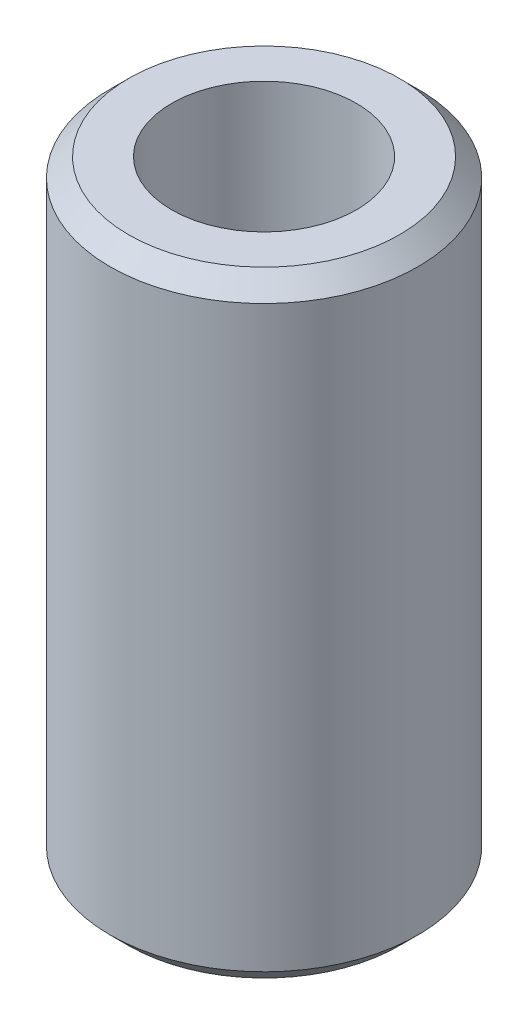
ISO-10303-21;
HEADER;
FILE_DESCRIPTION(('STEP AP214'),'2;1');
FILE_NAME('part.step','',(''),(''),'','','');
FILE_SCHEMA(('AUTOMOTIVE_DESIGN { 1 0 10303 214 1 1 1 1 }'));
ENDSEC;
DATA;
#1=APPLICATION_CONTEXT('core data for automotive mechanical design processes');
#2=APPLICATION_PROTOCOL_DEFINITION('international standard','automotive_design',2000,#1);
#3=PRODUCT_CONTEXT('',#1,'mechanical');
#4=PRODUCT('Part','Part','',(#3));
#5=PRODUCT_RELATED_PRODUCT_CATEGORY('part','',(#4));
#6=PRODUCT_DEFINITION_FORMATION('','',#4);
#7=PRODUCT_DEFINITION_CONTEXT('part definition',#1,'design');
#8=PRODUCT_DEFINITION('design','',#6,#7);
#9=PRODUCT_DEFINITION_SHAPE('','',#8);
#10=(LENGTH_UNIT() NAMED_UNIT(*) SI_UNIT(.MILLI.,.METRE.));
#11=(NAMED_UNIT(*) PLANE_ANGLE_UNIT() SI_UNIT($,.RADIAN.));
#12=(NAMED_UNIT(*) SI_UNIT($,.STERADIAN.) SOLID_ANGLE_UNIT());
#13=UNCERTAINTY_MEASURE_WITH_UNIT(LENGTH_MEASURE(1.E-05),#10,'distance_accuracy_value','');
#14=(GEOMETRIC_REPRESENTATION_CONTEXT(3) GLOBAL_UNCERTAINTY_ASSIGNED_CONTEXT((#13)) GLOBAL_UNIT_ASSIGNED_CONTEXT((#10,
#11,#12)) REPRESENTATION_CONTEXT('',''));
#15=CARTESIAN_POINT('',(0.,0.,0.));
#16=DIRECTION('',(0.,0.,1.));
#17=DIRECTION('',(1.,0.,0.));
#18=AXIS2_PLACEMENT_3D('',#15,#16,#17);
#19=CARTESIAN_POINT('',(0.,10.,0.));
#20=DIRECTION('',(0.,1.,0.));
#21=DIRECTION('',(0.,0.,1.));
#22=AXIS2_PLACEMENT_3D('',#19,#20,#21);
#23=PLANE('',#22);
#24=CARTESIAN_POINT('',(0.,10.,0.));
#25=DIRECTION('',(0.,1.,0.));
#26=DIRECTION('',(0.,0.,1.));
#27=AXIS2_PLACEMENT_3D('',#24,#25,#26);
#28=CIRCLE('',#27,2.2);
#29=CARTESIAN_POINT('',(0.,10.,2.2));
#30=VERTEX_POINT('',#29);
#31=EDGE_CURVE('E10',#30,#30,#28,.T.);
#32=ORIENTED_EDGE('',*,*,#31,.T.);
#33=EDGE_LOOP('',(#32));
#34=FACE_BOUND('',#33,.T.);
#35=CARTESIAN_POINT('',(0.,10.,0.));
#36=DIRECTION('',(0.,1.,0.));
#37=DIRECTION('',(0.,0.,1.));
#38=AXIS2_PLACEMENT_3D('',#35,#36,#37);
#39=CIRCLE('',#38,1.5);
#40=CARTESIAN_POINT('',(0.,10.,1.5));
#41=VERTEX_POINT('',#40);
#42=EDGE_CURVE('E60',#41,#41,#39,.T.);
#43=ORIENTED_EDGE('',*,*,#42,.F.);
#44=EDGE_LOOP('',(#43));
#45=FACE_BOUND('',#44,.T.);
#46=ADVANCED_FACE('F39',(#34,#45),#23,.T.);
#47=CARTESIAN_POINT('',(0.,0.,0.));
#48=DIRECTION('',(0.,1.,0.));
#49=DIRECTION('',(0.,0.,1.));
#50=AXIS2_PLACEMENT_3D('',#47,#48,#49);
#51=PLANE('',#50);
#52=CARTESIAN_POINT('',(0.,0.,0.));
#53=DIRECTION('',(0.,1.,0.));
#54=DIRECTION('',(0.,0.,1.));
#55=AXIS2_PLACEMENT_3D('',#52,#53,#54);
#56=CIRCLE('',#55,2.2);
#57=CARTESIAN_POINT('',(0.,0.,2.2));
#58=VERTEX_POINT('',#57);
#59=EDGE_CURVE('E47',#58,#58,#56,.F.);
#60=ORIENTED_EDGE('',*,*,#59,.T.);
#61=EDGE_LOOP('',(#60));
#62=FACE_BOUND('',#61,.T.);
#63=CARTESIAN_POINT('',(0.,0.,0.));
#64=DIRECTION('',(0.,1.,0.));
#65=DIRECTION('',(0.,0.,1.));
#66=AXIS2_PLACEMENT_3D('',#63,#64,#65);
#67=CIRCLE('',#66,1.5);
#68=CARTESIAN_POINT('',(0.,0.,1.5));
#69=VERTEX_POINT('',#68);
#70=EDGE_CURVE('E61',#69,#69,#67,.T.);
#71=ORIENTED_EDGE('',*,*,#70,.T.);
#72=EDGE_LOOP('',(#71));
#73=FACE_BOUND('',#72,.T.);
#74=ADVANCED_FACE('F71',(#62,#73),#51,.F.);
#75=CARTESIAN_POINT('',(0.,10.,0.));
#76=DIRECTION('',(0.,-1.,0.));
#77=DIRECTION('',(0.,0.,-1.));
#78=AXIS2_PLACEMENT_3D('',#75,#76,#77);
#79=CYLINDRICAL_SURFACE('',#78,2.5);
#80=CARTESIAN_POINT('',(0.,0.300000000000003,0.));
#81=DIRECTION('',(0.,1.,0.));
#82=DIRECTION('',(0.,0.,1.));
#83=AXIS2_PLACEMENT_3D('',#80,#81,#82);
#84=CIRCLE('',#83,2.5);
#85=CARTESIAN_POINT('',(0.,0.300000000000003,2.5));
#86=VERTEX_POINT('',#85);
#87=EDGE_CURVE('E51',#86,#86,#84,.T.);
#88=ORIENTED_EDGE('',*,*,#87,.T.);
#89=EDGE_LOOP('',(#88));
#90=FACE_BOUND('',#89,.T.);
#91=CARTESIAN_POINT('',(0.,9.7,0.));
#92=DIRECTION('',(0.,1.,0.));
#93=DIRECTION('',(0.,0.,1.));
#94=AXIS2_PLACEMENT_3D('',#91,#92,#93);
#95=CIRCLE('',#94,2.5);
#96=CARTESIAN_POINT('',(0.,9.7,2.5));
#97=VERTEX_POINT('',#96);
#98=EDGE_CURVE('E55',#97,#97,#95,.F.);
#99=ORIENTED_EDGE('',*,*,#98,.T.);
#100=EDGE_LOOP('',(#99));
#101=FACE_BOUND('',#100,.T.);
#102=ADVANCED_FACE('F77',(#90,#101),#79,.T.);
#103=CARTESIAN_POINT('',(0.,10.,0.));
#104=DIRECTION('',(0.,-1.,0.));
#105=DIRECTION('',(0.,0.,-1.));
#106=AXIS2_PLACEMENT_3D('',#103,#104,#105);
#107=CYLINDRICAL_SURFACE('',#106,1.5);
#108=ORIENTED_EDGE('',*,*,#42,.T.);
#109=EDGE_LOOP('',(#108));
#110=FACE_BOUND('',#109,.T.);
#111=ORIENTED_EDGE('',*,*,#70,.F.);
#112=EDGE_LOOP('',(#111));
#113=FACE_BOUND('',#112,.T.);
#114=ADVANCED_FACE('F67',(#110,#113),#107,.F.);
#115=CARTESIAN_POINT('',(0.,0.300000000000003,0.));
#116=DIRECTION('',(0.,1.,0.));
#117=DIRECTION('',(0.,0.,1.));
#118=AXIS2_PLACEMENT_3D('',#115,#116,#117);
#119=CONICAL_SURFACE('',#118,2.5,0.785398163397448);
#120=ORIENTED_EDGE('',*,*,#59,.F.);
#121=EDGE_LOOP('',(#120));
#122=FACE_BOUND('',#121,.T.);
#123=ORIENTED_EDGE('',*,*,#87,.F.);
#124=EDGE_LOOP('',(#123));
#125=FACE_BOUND('',#124,.T.);
#126=ADVANCED_FACE('F84',(#122,#125),#119,.T.);
#127=CARTESIAN_POINT('',(0.,10.,0.));
#128=DIRECTION('',(0.,-1.,0.));
#129=DIRECTION('',(0.,0.,-1.));
#130=AXIS2_PLACEMENT_3D('',#127,#128,#129);
#131=CONICAL_SURFACE('',#130,2.2,0.785398163397447);
#132=ORIENTED_EDGE('',*,*,#98,.F.);
#133=EDGE_LOOP('',(#132));
#134=FACE_BOUND('',#133,.T.);
#135=ORIENTED_EDGE('',*,*,#31,.F.);
#136=EDGE_LOOP('',(#135));
#137=FACE_BOUND('',#136,.T.);
#138=ADVANCED_FACE('F42',(#134,#137),#131,.T.);
#139=CLOSED_SHELL('',(#46,#74,#102,#114,#126,#138));
#140=MANIFOLD_SOLID_BREP('B2',#139);
#141=ADVANCED_BREP_SHAPE_REPRESENTATION('',(#18,#140),#14);
#142=SHAPE_DEFINITION_REPRESENTATION(#9,#141);
ENDSEC;
END-ISO-10303-21;
